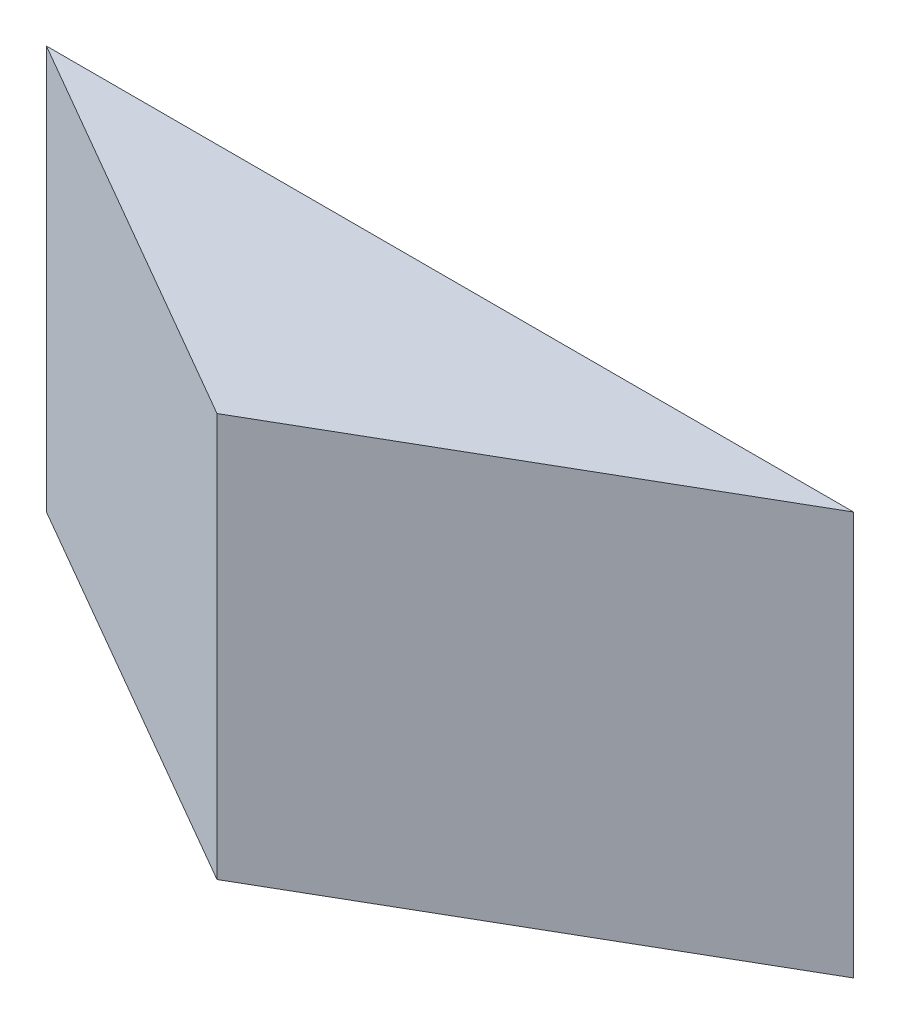
ISO-10303-21;
HEADER;
FILE_DESCRIPTION(('STEP AP214'),'2;1');
FILE_NAME('part.step','',(''),(''),'','','');
FILE_SCHEMA(('AUTOMOTIVE_DESIGN { 1 0 10303 214 1 1 1 1 }'));
ENDSEC;
DATA;
#1=APPLICATION_CONTEXT('core data for automotive mechanical design processes');
#2=APPLICATION_PROTOCOL_DEFINITION('international standard','automotive_design',2000,#1);
#3=PRODUCT_CONTEXT('',#1,'mechanical');
#4=PRODUCT('Part','Part','',(#3));
#5=PRODUCT_RELATED_PRODUCT_CATEGORY('part','',(#4));
#6=PRODUCT_DEFINITION_FORMATION('','',#4);
#7=PRODUCT_DEFINITION_CONTEXT('part definition',#1,'design');
#8=PRODUCT_DEFINITION('design','',#6,#7);
#9=PRODUCT_DEFINITION_SHAPE('','',#8);
#10=(LENGTH_UNIT() NAMED_UNIT(*) SI_UNIT(.MILLI.,.METRE.));
#11=(NAMED_UNIT(*) PLANE_ANGLE_UNIT() SI_UNIT($,.RADIAN.));
#12=(NAMED_UNIT(*) SI_UNIT($,.STERADIAN.) SOLID_ANGLE_UNIT());
#13=UNCERTAINTY_MEASURE_WITH_UNIT(LENGTH_MEASURE(1.E-05),#10,'distance_accuracy_value','');
#14=(GEOMETRIC_REPRESENTATION_CONTEXT(3) GLOBAL_UNCERTAINTY_ASSIGNED_CONTEXT((#13)) GLOBAL_UNIT_ASSIGNED_CONTEXT((#10,
#11,#12)) REPRESENTATION_CONTEXT('',''));
#15=CARTESIAN_POINT('',(0.,0.,0.));
#16=DIRECTION('',(0.,0.,1.));
#17=DIRECTION('',(1.,0.,0.));
#18=AXIS2_PLACEMENT_3D('',#15,#16,#17);
#19=CARTESIAN_POINT('',(20.,20.,0.));
#20=DIRECTION('',(-0.499999999999995,0.,-0.866025403784442));
#21=DIRECTION('',(-0.866025403784442,0.,0.499999999999995));
#22=AXIS2_PLACEMENT_3D('',#19,#20,#21);
#23=PLANE('',#22);
#24=DIRECTION('',(0.866025403784442,0.,-0.499999999999995));
#25=VECTOR('',#24,1.);
#26=CARTESIAN_POINT('',(20.,0.,0.));
#27=LINE('',#26,#25);
#28=CARTESIAN_POINT('',(0.,0.,11.5470053837924));
#29=VERTEX_POINT('',#28);
#30=CARTESIAN_POINT('',(20.,0.,0.));
#31=VERTEX_POINT('',#30);
#32=EDGE_CURVE('E89',#29,#31,#27,.T.);
#33=ORIENTED_EDGE('',*,*,#32,.T.);
#34=DIRECTION('',(0.,-1.,0.));
#35=VECTOR('',#34,1.);
#36=CARTESIAN_POINT('',(20.,20.,0.));
#37=LINE('',#36,#35);
#38=CARTESIAN_POINT('',(20.,20.,0.));
#39=VERTEX_POINT('',#38);
#40=EDGE_CURVE('E11',#39,#31,#37,.T.);
#41=ORIENTED_EDGE('',*,*,#40,.F.);
#42=DIRECTION('',(0.866025403784442,0.,-0.499999999999995));
#43=VECTOR('',#42,1.);
#44=CARTESIAN_POINT('',(20.,20.,0.));
#45=LINE('',#44,#43);
#46=CARTESIAN_POINT('',(0.,20.,11.5470053837924));
#47=VERTEX_POINT('',#46);
#48=EDGE_CURVE('E81',#47,#39,#45,.T.);
#49=ORIENTED_EDGE('',*,*,#48,.F.);
#50=DIRECTION('',(0.,-1.,0.));
#51=VECTOR('',#50,1.);
#52=CARTESIAN_POINT('',(0.,20.,11.5470053837924));
#53=LINE('',#52,#51);
#54=EDGE_CURVE('E90',#47,#29,#53,.T.);
#55=ORIENTED_EDGE('',*,*,#54,.T.);
#56=EDGE_LOOP('',(#33,#41,#49,#55));
#57=FACE_BOUND('',#56,.T.);
#58=ADVANCED_FACE('F39',(#57),#23,.F.);
#59=CARTESIAN_POINT('',(-20.,20.,0.));
#60=DIRECTION('',(0.,0.,1.));
#61=DIRECTION('',(1.,0.,0.));
#62=AXIS2_PLACEMENT_3D('',#59,#60,#61);
#63=PLANE('',#62);
#64=DIRECTION('',(-1.,0.,0.));
#65=VECTOR('',#64,1.);
#66=CARTESIAN_POINT('',(-20.,0.,0.));
#67=LINE('',#66,#65);
#68=CARTESIAN_POINT('',(-20.,0.,0.));
#69=VERTEX_POINT('',#68);
#70=EDGE_CURVE('E68',#31,#69,#67,.T.);
#71=ORIENTED_EDGE('',*,*,#70,.T.);
#72=DIRECTION('',(0.,-1.,0.));
#73=VECTOR('',#72,1.);
#74=CARTESIAN_POINT('',(-20.,20.,0.));
#75=LINE('',#74,#73);
#76=CARTESIAN_POINT('',(-20.,20.,0.));
#77=VERTEX_POINT('',#76);
#78=EDGE_CURVE('E48',#77,#69,#75,.T.);
#79=ORIENTED_EDGE('',*,*,#78,.F.);
#80=DIRECTION('',(-1.,0.,0.));
#81=VECTOR('',#80,1.);
#82=CARTESIAN_POINT('',(-20.,20.,0.));
#83=LINE('',#82,#81);
#84=EDGE_CURVE('E76',#39,#77,#83,.T.);
#85=ORIENTED_EDGE('',*,*,#84,.F.);
#86=ORIENTED_EDGE('',*,*,#40,.T.);
#87=EDGE_LOOP('',(#71,#79,#85,#86));
#88=FACE_BOUND('',#87,.T.);
#89=ADVANCED_FACE('F77',(#88),#63,.F.);
#90=CARTESIAN_POINT('',(-20.,20.,0.));
#91=DIRECTION('',(0.499999999999995,0.,-0.866025403784442));
#92=DIRECTION('',(-0.866025403784442,0.,-0.499999999999995));
#93=AXIS2_PLACEMENT_3D('',#90,#91,#92);
#94=PLANE('',#93);
#95=DIRECTION('',(0.866025403784442,0.,0.499999999999995));
#96=VECTOR('',#95,1.);
#97=CARTESIAN_POINT('',(-20.,0.,0.));
#98=LINE('',#97,#96);
#99=EDGE_CURVE('E73',#69,#29,#98,.T.);
#100=ORIENTED_EDGE('',*,*,#99,.T.);
#101=ORIENTED_EDGE('',*,*,#54,.F.);
#102=DIRECTION('',(0.866025403784442,0.,0.499999999999995));
#103=VECTOR('',#102,1.);
#104=CARTESIAN_POINT('',(-20.,20.,0.));
#105=LINE('',#104,#103);
#106=EDGE_CURVE('E56',#77,#47,#105,.T.);
#107=ORIENTED_EDGE('',*,*,#106,.F.);
#108=ORIENTED_EDGE('',*,*,#78,.T.);
#109=EDGE_LOOP('',(#100,#101,#107,#108));
#110=FACE_BOUND('',#109,.T.);
#111=ADVANCED_FACE('F102',(#110),#94,.F.);
#112=CARTESIAN_POINT('',(0.,20.,0.));
#113=DIRECTION('',(0.,1.,0.));
#114=DIRECTION('',(0.,0.,1.));
#115=AXIS2_PLACEMENT_3D('',#112,#113,#114);
#116=PLANE('',#115);
#117=ORIENTED_EDGE('',*,*,#48,.T.);
#118=ORIENTED_EDGE('',*,*,#84,.T.);
#119=ORIENTED_EDGE('',*,*,#106,.T.);
#120=EDGE_LOOP('',(#117,#118,#119));
#121=FACE_BOUND('',#120,.T.);
#122=ADVANCED_FACE('F84',(#121),#116,.T.);
#123=CARTESIAN_POINT('',(0.,0.,0.));
#124=DIRECTION('',(0.,1.,0.));
#125=DIRECTION('',(0.,0.,1.));
#126=AXIS2_PLACEMENT_3D('',#123,#124,#125);
#127=PLANE('',#126);
#128=ORIENTED_EDGE('',*,*,#32,.F.);
#129=ORIENTED_EDGE('',*,*,#99,.F.);
#130=ORIENTED_EDGE('',*,*,#70,.F.);
#131=EDGE_LOOP('',(#128,#129,#130));
#132=FACE_BOUND('',#131,.T.);
#133=ADVANCED_FACE('F103',(#132),#127,.F.);
#134=CLOSED_SHELL('',(#58,#89,#111,#122,#133));
#135=MANIFOLD_SOLID_BREP('B2',#134);
#136=ADVANCED_BREP_SHAPE_REPRESENTATION('',(#18,#135),#14);
#137=SHAPE_DEFINITION_REPRESENTATION(#9,#136);
ENDSEC;
END-ISO-10303-21;
